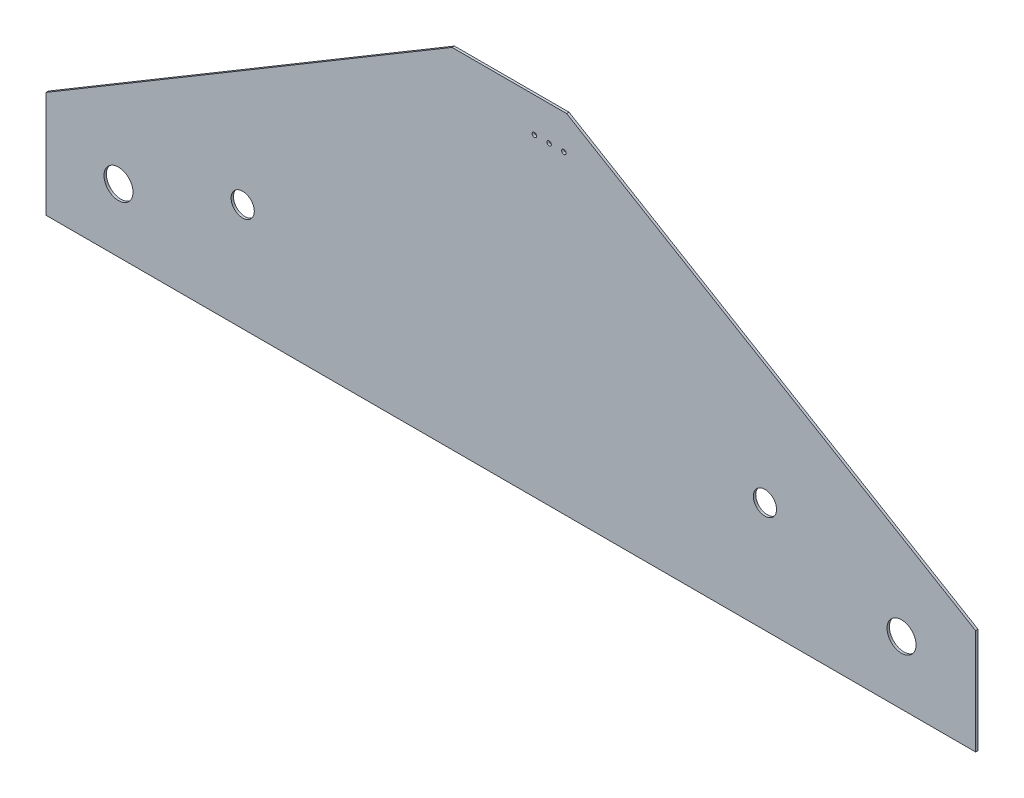
ISO-10303-21;
HEADER;
FILE_DESCRIPTION(('STEP AP214'),'2;1');
FILE_NAME('part.step','',(''),(''),'','','');
FILE_SCHEMA(('AUTOMOTIVE_DESIGN { 1 0 10303 214 1 1 1 1 }'));
ENDSEC;
DATA;
#1=APPLICATION_CONTEXT('core data for automotive mechanical design processes');
#2=APPLICATION_PROTOCOL_DEFINITION('international standard','automotive_design',2000,#1);
#3=PRODUCT_CONTEXT('',#1,'mechanical');
#4=PRODUCT('Part','Part','',(#3));
#5=PRODUCT_RELATED_PRODUCT_CATEGORY('part','',(#4));
#6=PRODUCT_DEFINITION_FORMATION('','',#4);
#7=PRODUCT_DEFINITION_CONTEXT('part definition',#1,'design');
#8=PRODUCT_DEFINITION('design','',#6,#7);
#9=PRODUCT_DEFINITION_SHAPE('','',#8);
#10=(LENGTH_UNIT() NAMED_UNIT(*) SI_UNIT(.MILLI.,.METRE.));
#11=(NAMED_UNIT(*) PLANE_ANGLE_UNIT() SI_UNIT($,.RADIAN.));
#12=(NAMED_UNIT(*) SI_UNIT($,.STERADIAN.) SOLID_ANGLE_UNIT());
#13=UNCERTAINTY_MEASURE_WITH_UNIT(LENGTH_MEASURE(1.E-05),#10,'distance_accuracy_value','');
#14=(GEOMETRIC_REPRESENTATION_CONTEXT(3) GLOBAL_UNCERTAINTY_ASSIGNED_CONTEXT((#13)) GLOBAL_UNIT_ASSIGNED_CONTEXT((#10,
#11,#12)) REPRESENTATION_CONTEXT('',''));
#15=CARTESIAN_POINT('',(0.,0.,0.));
#16=DIRECTION('',(0.,0.,1.));
#17=DIRECTION('',(1.,0.,0.));
#18=AXIS2_PLACEMENT_3D('',#15,#16,#17);
#19=CARTESIAN_POINT('',(0.5999988,0.5999988,0.41148));
#20=DIRECTION('',(0.,0.,1.));
#21=DIRECTION('',(1.,0.,0.));
#22=AXIS2_PLACEMENT_3D('',#19,#20,#21);
#23=PLANE('',#22);
#24=CARTESIAN_POINT('',(89.8809988,54.7019988,0.41148));
#25=DIRECTION('',(0.,0.,-1.));
#26=DIRECTION('',(-1.,0.,0.));
#27=AXIS2_PLACEMENT_3D('',#24,#25,#26);
#28=CIRCLE('',#27,0.381);
#29=CARTESIAN_POINT('',(89.4999988,54.7019988,0.41148));
#30=VERTEX_POINT('',#29);
#31=EDGE_CURVE('E115',#30,#30,#28,.T.);
#32=ORIENTED_EDGE('',*,*,#31,.T.);
#33=EDGE_LOOP('',(#32));
#34=FACE_BOUND('',#33,.T.);
#35=CARTESIAN_POINT('',(87.3409988,54.7019988,0.41148));
#36=DIRECTION('',(0.,0.,-1.));
#37=DIRECTION('',(-1.,0.,0.));
#38=AXIS2_PLACEMENT_3D('',#35,#36,#37);
#39=CIRCLE('',#38,0.381);
#40=CARTESIAN_POINT('',(86.9599988,54.7019988,0.41148));
#41=VERTEX_POINT('',#40);
#42=EDGE_CURVE('E118',#41,#41,#39,.T.);
#43=ORIENTED_EDGE('',*,*,#42,.T.);
#44=EDGE_LOOP('',(#43));
#45=FACE_BOUND('',#44,.T.);
#46=CARTESIAN_POINT('',(148.10000098,11.44999996,0.41148));
#47=DIRECTION('',(0.,0.,-1.));
#48=DIRECTION('',(-1.,0.,0.));
#49=AXIS2_PLACEMENT_3D('',#46,#47,#48);
#50=CIRCLE('',#49,2.50000008);
#51=CARTESIAN_POINT('',(145.6000009,11.44999996,0.41148));
#52=VERTEX_POINT('',#51);
#53=EDGE_CURVE('E121',#52,#52,#50,.T.);
#54=ORIENTED_EDGE('',*,*,#53,.T.);
#55=EDGE_LOOP('',(#54));
#56=FACE_BOUND('',#55,.T.);
#57=CARTESIAN_POINT('',(124.5519988,19.6499988,0.41148));
#58=DIRECTION('',(0.,0.,-1.));
#59=DIRECTION('',(-1.,0.,0.));
#60=AXIS2_PLACEMENT_3D('',#57,#58,#59);
#61=CIRCLE('',#60,1.99999854);
#62=CARTESIAN_POINT('',(122.55200026,19.6499988,0.41148));
#63=VERTEX_POINT('',#62);
#64=EDGE_CURVE('E124',#63,#63,#61,.T.);
#65=ORIENTED_EDGE('',*,*,#64,.T.);
#66=EDGE_LOOP('',(#65));
#67=FACE_BOUND('',#66,.T.);
#68=CARTESIAN_POINT('',(84.8009988,54.7019988,0.41148));
#69=DIRECTION('',(0.,0.,-1.));
#70=DIRECTION('',(-1.,0.,0.));
#71=AXIS2_PLACEMENT_3D('',#68,#69,#70);
#72=CIRCLE('',#71,0.381);
#73=CARTESIAN_POINT('',(84.4199988,54.7019988,0.41148));
#74=VERTEX_POINT('',#73);
#75=EDGE_CURVE('E127',#74,#74,#72,.T.);
#76=ORIENTED_EDGE('',*,*,#75,.T.);
#77=EDGE_LOOP('',(#76));
#78=FACE_BOUND('',#77,.T.);
#79=CARTESIAN_POINT('',(34.5089988,19.1419988,0.41148));
#80=DIRECTION('',(0.,0.,-1.));
#81=DIRECTION('',(-1.,0.,0.));
#82=AXIS2_PLACEMENT_3D('',#79,#80,#81);
#83=CIRCLE('',#82,1.99999854);
#84=CARTESIAN_POINT('',(32.50900026,19.1419988,0.41148));
#85=VERTEX_POINT('',#84);
#86=EDGE_CURVE('E129',#85,#85,#83,.T.);
#87=ORIENTED_EDGE('',*,*,#86,.T.);
#88=EDGE_LOOP('',(#87));
#89=FACE_BOUND('',#88,.T.);
#90=CARTESIAN_POINT('',(13.0999992,11.53999978,0.41148));
#91=DIRECTION('',(0.,0.,-1.));
#92=DIRECTION('',(-1.,0.,0.));
#93=AXIS2_PLACEMENT_3D('',#90,#91,#92);
#94=CIRCLE('',#93,2.50000008);
#95=CARTESIAN_POINT('',(10.59999912,11.53999978,0.41148));
#96=VERTEX_POINT('',#95);
#97=EDGE_CURVE('E20',#96,#96,#94,.T.);
#98=ORIENTED_EDGE('',*,*,#97,.T.);
#99=EDGE_LOOP('',(#98));
#100=FACE_BOUND('',#99,.T.);
#101=DIRECTION('',(-0.858999586489203,-0.511976279149121,0.));
#102=VECTOR('',#101,1.);
#103=CARTESIAN_POINT('',(0.60000134,18.94414296,0.41148));
#104=LINE('',#103,#102);
#105=CARTESIAN_POINT('',(0.600001340000001,18.94414296,0.41148));
#106=VERTEX_POINT('',#105);
#107=CARTESIAN_POINT('',(70.6098384599961,60.6710267400066,0.41148));
#108=VERTEX_POINT('',#107);
#109=EDGE_CURVE('E145',#106,#108,#104,.F.);
#110=ORIENTED_EDGE('',*,*,#109,.F.);
#111=DIRECTION('',(-1.38463805007299E-07,-0.99999999999999,0.));
#112=VECTOR('',#111,1.);
#113=CARTESIAN_POINT('',(0.5999988,0.5999988,0.41148));
#114=LINE('',#113,#112);
#115=CARTESIAN_POINT('',(0.599999435000001,0.5999988,0.41148));
#116=VERTEX_POINT('',#115);
#117=EDGE_CURVE('E85',#116,#106,#114,.F.);
#118=ORIENTED_EDGE('',*,*,#117,.F.);
#119=DIRECTION('',(1.,0.,0.));
#120=VECTOR('',#119,1.);
#121=CARTESIAN_POINT('',(160.8739988,0.5999988,0.41148));
#122=LINE('',#121,#120);
#123=CARTESIAN_POINT('',(160.8739988,0.599998799999999,0.41148));
#124=VERTEX_POINT('',#123);
#125=EDGE_CURVE('E81',#124,#116,#122,.F.);
#126=ORIENTED_EDGE('',*,*,#125,.F.);
#127=DIRECTION('',(-1.40170357279899E-07,0.99999999999999,0.));
#128=VECTOR('',#127,1.);
#129=CARTESIAN_POINT('',(160.87399626,18.72080584,0.41148));
#130=LINE('',#129,#128);
#131=CARTESIAN_POINT('',(160.873997529996,18.7208050844236,0.41148));
#132=VERTEX_POINT('',#131);
#133=EDGE_CURVE('E72',#132,#124,#130,.F.);
#134=ORIENTED_EDGE('',*,*,#133,.F.);
#135=DIRECTION('',(-0.85940677887988,0.511292468568929,0.));
#136=VECTOR('',#135,1.);
#137=CARTESIAN_POINT('',(90.36195034,60.67099626,0.41148));
#138=LINE('',#137,#136);
#139=CARTESIAN_POINT('',(90.36195034,60.67099626,0.41148));
#140=VERTEX_POINT('',#139);
#141=EDGE_CURVE('E67',#140,#132,#138,.F.);
#142=ORIENTED_EDGE('',*,*,#141,.F.);
#143=DIRECTION('',(-0.999999999998809,1.54312613175871E-06,0.));
#144=VECTOR('',#143,1.);
#145=CARTESIAN_POINT('',(70.60983846,60.67102674,0.41148));
#146=LINE('',#145,#144);
#147=EDGE_CURVE('E149',#108,#140,#146,.F.);
#148=ORIENTED_EDGE('',*,*,#147,.F.);
#149=EDGE_LOOP('',(#110,#118,#126,#134,#142,#148));
#150=FACE_BOUND('',#149,.T.);
#151=ADVANCED_FACE('F17',(#34,#45,#56,#67,#78,#89,#100,#150),#23,.T.);
#152=CARTESIAN_POINT('',(160.8739988,0.5999988,0.));
#153=DIRECTION('',(0.,-1.,0.));
#154=DIRECTION('',(0.,0.,-1.));
#155=AXIS2_PLACEMENT_3D('',#152,#153,#154);
#156=PLANE('',#155);
#157=DIRECTION('',(0.,0.,1.));
#158=VECTOR('',#157,1.);
#159=CARTESIAN_POINT('',(0.5999988,0.5999988,0.));
#160=LINE('',#159,#158);
#161=CARTESIAN_POINT('',(0.599999435000001,0.5999988,0.));
#162=VERTEX_POINT('',#161);
#163=EDGE_CURVE('E137',#162,#116,#160,.T.);
#164=ORIENTED_EDGE('',*,*,#163,.F.);
#165=DIRECTION('',(1.,0.,0.));
#166=VECTOR('',#165,1.);
#167=CARTESIAN_POINT('',(0.5999988,0.5999988,0.));
#168=LINE('',#167,#166);
#169=CARTESIAN_POINT('',(160.8739988,0.599998799999999,0.));
#170=VERTEX_POINT('',#169);
#171=EDGE_CURVE('E92',#162,#170,#168,.T.);
#172=ORIENTED_EDGE('',*,*,#171,.T.);
#173=DIRECTION('',(0.,0.,1.));
#174=VECTOR('',#173,1.);
#175=CARTESIAN_POINT('',(160.8739988,0.599998799999998,0.));
#176=LINE('',#175,#174);
#177=EDGE_CURVE('E77',#124,#170,#176,.F.);
#178=ORIENTED_EDGE('',*,*,#177,.F.);
#179=ORIENTED_EDGE('',*,*,#125,.T.);
#180=EDGE_LOOP('',(#164,#172,#178,#179));
#181=FACE_BOUND('',#180,.T.);
#182=ADVANCED_FACE('F91',(#181),#156,.T.);
#183=CARTESIAN_POINT('',(160.87399626,18.72080584,0.));
#184=DIRECTION('',(0.99999999999999,1.40170357279899E-07,0.));
#185=DIRECTION('',(-1.40170357279899E-07,0.99999999999999,0.));
#186=AXIS2_PLACEMENT_3D('',#183,#184,#185);
#187=PLANE('',#186);
#188=ORIENTED_EDGE('',*,*,#177,.T.);
#189=DIRECTION('',(0.,1.,0.));
#190=VECTOR('',#189,1.);
#191=CARTESIAN_POINT('',(160.8739988,0.5999988,0.));
#192=LINE('',#191,#190);
#193=CARTESIAN_POINT('',(160.873996894996,18.7208054622083,0.));
#194=VERTEX_POINT('',#193);
#195=EDGE_CURVE('E158',#170,#194,#192,.T.);
#196=ORIENTED_EDGE('',*,*,#195,.T.);
#197=DIRECTION('',(0.,0.,1.));
#198=VECTOR('',#197,1.);
#199=CARTESIAN_POINT('',(160.873996259983,18.7208058399719,0.));
#200=LINE('',#199,#198);
#201=EDGE_CURVE('E79',#132,#194,#200,.F.);
#202=ORIENTED_EDGE('',*,*,#201,.F.);
#203=ORIENTED_EDGE('',*,*,#133,.T.);
#204=EDGE_LOOP('',(#188,#196,#202,#203));
#205=FACE_BOUND('',#204,.T.);
#206=ADVANCED_FACE('F74',(#205),#187,.T.);
#207=CARTESIAN_POINT('',(90.36195034,60.67099626,0.));
#208=DIRECTION('',(0.511292468568929,0.85940677887988,0.));
#209=DIRECTION('',(-0.85940677887988,0.511292468568929,0.));
#210=AXIS2_PLACEMENT_3D('',#207,#208,#209);
#211=PLANE('',#210);
#212=ORIENTED_EDGE('',*,*,#201,.T.);
#213=DIRECTION('',(-0.859406778880083,0.511292468568587,0.));
#214=VECTOR('',#213,1.);
#215=CARTESIAN_POINT('',(160.87399626,18.72080584,0.));
#216=LINE('',#215,#214);
#217=CARTESIAN_POINT('',(90.36195034,60.67099626,0.));
#218=VERTEX_POINT('',#217);
#219=EDGE_CURVE('E153',#194,#218,#216,.T.);
#220=ORIENTED_EDGE('',*,*,#219,.T.);
#221=DIRECTION('',(0.,0.,1.));
#222=VECTOR('',#221,1.);
#223=CARTESIAN_POINT('',(90.36195034,60.67099626,0.));
#224=LINE('',#223,#222);
#225=EDGE_CURVE('E147',#140,#218,#224,.F.);
#226=ORIENTED_EDGE('',*,*,#225,.F.);
#227=ORIENTED_EDGE('',*,*,#141,.T.);
#228=EDGE_LOOP('',(#212,#220,#226,#227));
#229=FACE_BOUND('',#228,.T.);
#230=ADVANCED_FACE('F152',(#229),#211,.T.);
#231=CARTESIAN_POINT('',(70.60983846,60.67102674,0.));
#232=DIRECTION('',(1.54312613175871E-06,0.999999999998809,0.));
#233=DIRECTION('',(-0.999999999998809,1.54312613175871E-06,0.));
#234=AXIS2_PLACEMENT_3D('',#231,#232,#233);
#235=PLANE('',#234);
#236=ORIENTED_EDGE('',*,*,#225,.T.);
#237=DIRECTION('',(-0.99999999999881,1.54312613159079E-06,0.));
#238=VECTOR('',#237,1.);
#239=CARTESIAN_POINT('',(90.36195034,60.67099626,0.));
#240=LINE('',#239,#238);
#241=CARTESIAN_POINT('',(70.6098384599961,60.6710267400066,0.));
#242=VERTEX_POINT('',#241);
#243=EDGE_CURVE('E160',#218,#242,#240,.T.);
#244=ORIENTED_EDGE('',*,*,#243,.T.);
#245=DIRECTION('',(0.,0.,1.));
#246=VECTOR('',#245,1.);
#247=CARTESIAN_POINT('',(70.6098384599843,60.6710267400263,0.));
#248=LINE('',#247,#246);
#249=EDGE_CURVE('E143',#108,#242,#248,.F.);
#250=ORIENTED_EDGE('',*,*,#249,.F.);
#251=ORIENTED_EDGE('',*,*,#147,.T.);
#252=EDGE_LOOP('',(#236,#244,#250,#251));
#253=FACE_BOUND('',#252,.T.);
#254=ADVANCED_FACE('F173',(#253),#235,.T.);
#255=CARTESIAN_POINT('',(0.60000134,18.94414296,0.));
#256=DIRECTION('',(-0.511976279149121,0.858999586489203,0.));
#257=DIRECTION('',(-0.858999586489203,-0.511976279149121,0.));
#258=AXIS2_PLACEMENT_3D('',#255,#256,#257);
#259=PLANE('',#258);
#260=ORIENTED_EDGE('',*,*,#249,.T.);
#261=DIRECTION('',(-0.858999586489395,-0.511976279148799,0.));
#262=VECTOR('',#261,1.);
#263=CARTESIAN_POINT('',(70.60983846,60.67102674,0.));
#264=LINE('',#263,#262);
#265=CARTESIAN_POINT('',(0.60000134,18.94414296,0.));
#266=VERTEX_POINT('',#265);
#267=EDGE_CURVE('E164',#242,#266,#264,.T.);
#268=ORIENTED_EDGE('',*,*,#267,.T.);
#269=DIRECTION('',(0.,0.,1.));
#270=VECTOR('',#269,1.);
#271=CARTESIAN_POINT('',(0.60000134,18.94414296,0.));
#272=LINE('',#271,#270);
#273=EDGE_CURVE('E35',#106,#266,#272,.F.);
#274=ORIENTED_EDGE('',*,*,#273,.F.);
#275=ORIENTED_EDGE('',*,*,#109,.T.);
#276=EDGE_LOOP('',(#260,#268,#274,#275));
#277=FACE_BOUND('',#276,.T.);
#278=ADVANCED_FACE('F169',(#277),#259,.T.);
#279=CARTESIAN_POINT('',(0.5999988,0.5999988,0.));
#280=DIRECTION('',(-0.99999999999999,1.38463805007299E-07,0.));
#281=DIRECTION('',(-1.38463805007299E-07,-0.99999999999999,0.));
#282=AXIS2_PLACEMENT_3D('',#279,#280,#281);
#283=PLANE('',#282);
#284=ORIENTED_EDGE('',*,*,#273,.T.);
#285=DIRECTION('',(0.,1.,0.));
#286=VECTOR('',#285,1.);
#287=CARTESIAN_POINT('',(0.60000134,0.5999988,0.));
#288=LINE('',#287,#286);
#289=EDGE_CURVE('E114',#266,#162,#288,.F.);
#290=ORIENTED_EDGE('',*,*,#289,.T.);
#291=ORIENTED_EDGE('',*,*,#163,.T.);
#292=ORIENTED_EDGE('',*,*,#117,.T.);
#293=EDGE_LOOP('',(#284,#290,#291,#292));
#294=FACE_BOUND('',#293,.T.);
#295=ADVANCED_FACE('F167',(#294),#283,.T.);
#296=CARTESIAN_POINT('',(13.0999992,11.53999978,0.));
#297=DIRECTION('',(0.,0.,-1.));
#298=DIRECTION('',(-1.,0.,0.));
#299=AXIS2_PLACEMENT_3D('',#296,#297,#298);
#300=CYLINDRICAL_SURFACE('',#299,2.50000008);
#301=ORIENTED_EDGE('',*,*,#97,.F.);
#302=EDGE_LOOP('',(#301));
#303=FACE_BOUND('',#302,.T.);
#304=CARTESIAN_POINT('',(13.0999992,11.53999978,0.));
#305=DIRECTION('',(0.,0.,-1.));
#306=DIRECTION('',(-1.,0.,0.));
#307=AXIS2_PLACEMENT_3D('',#304,#305,#306);
#308=CIRCLE('',#307,2.50000008);
#309=CARTESIAN_POINT('',(10.59999912,11.53999978,0.));
#310=VERTEX_POINT('',#309);
#311=EDGE_CURVE('E111',#310,#310,#308,.T.);
#312=ORIENTED_EDGE('',*,*,#311,.T.);
#313=EDGE_LOOP('',(#312));
#314=FACE_BOUND('',#313,.T.);
#315=ADVANCED_FACE('F214',(#303,#314),#300,.F.);
#316=CARTESIAN_POINT('',(34.5089988,19.1419988,0.));
#317=DIRECTION('',(0.,0.,-1.));
#318=DIRECTION('',(-1.,0.,0.));
#319=AXIS2_PLACEMENT_3D('',#316,#317,#318);
#320=CYLINDRICAL_SURFACE('',#319,1.99999854);
#321=ORIENTED_EDGE('',*,*,#86,.F.);
#322=EDGE_LOOP('',(#321));
#323=FACE_BOUND('',#322,.T.);
#324=CARTESIAN_POINT('',(34.5089988,19.1419988,0.));
#325=DIRECTION('',(0.,0.,-1.));
#326=DIRECTION('',(-1.,0.,0.));
#327=AXIS2_PLACEMENT_3D('',#324,#325,#326);
#328=CIRCLE('',#327,1.99999854);
#329=CARTESIAN_POINT('',(32.50900026,19.1419988,0.));
#330=VERTEX_POINT('',#329);
#331=EDGE_CURVE('E108',#330,#330,#328,.T.);
#332=ORIENTED_EDGE('',*,*,#331,.T.);
#333=EDGE_LOOP('',(#332));
#334=FACE_BOUND('',#333,.T.);
#335=ADVANCED_FACE('F210',(#323,#334),#320,.F.);
#336=CARTESIAN_POINT('',(84.8009988,54.7019988,0.));
#337=DIRECTION('',(0.,0.,-1.));
#338=DIRECTION('',(-1.,0.,0.));
#339=AXIS2_PLACEMENT_3D('',#336,#337,#338);
#340=CYLINDRICAL_SURFACE('',#339,0.381);
#341=ORIENTED_EDGE('',*,*,#75,.F.);
#342=EDGE_LOOP('',(#341));
#343=FACE_BOUND('',#342,.T.);
#344=CARTESIAN_POINT('',(84.8009988,54.7019988,0.));
#345=DIRECTION('',(0.,0.,-1.));
#346=DIRECTION('',(-1.,0.,0.));
#347=AXIS2_PLACEMENT_3D('',#344,#345,#346);
#348=CIRCLE('',#347,0.381);
#349=CARTESIAN_POINT('',(84.4199988,54.7019988,0.));
#350=VERTEX_POINT('',#349);
#351=EDGE_CURVE('E105',#350,#350,#348,.T.);
#352=ORIENTED_EDGE('',*,*,#351,.T.);
#353=EDGE_LOOP('',(#352));
#354=FACE_BOUND('',#353,.T.);
#355=ADVANCED_FACE('F206',(#343,#354),#340,.F.);
#356=CARTESIAN_POINT('',(124.5519988,19.6499988,0.));
#357=DIRECTION('',(0.,0.,-1.));
#358=DIRECTION('',(-1.,0.,0.));
#359=AXIS2_PLACEMENT_3D('',#356,#357,#358);
#360=CYLINDRICAL_SURFACE('',#359,1.99999854);
#361=ORIENTED_EDGE('',*,*,#64,.F.);
#362=EDGE_LOOP('',(#361));
#363=FACE_BOUND('',#362,.T.);
#364=CARTESIAN_POINT('',(124.5519988,19.6499988,0.));
#365=DIRECTION('',(0.,0.,-1.));
#366=DIRECTION('',(-1.,0.,0.));
#367=AXIS2_PLACEMENT_3D('',#364,#365,#366);
#368=CIRCLE('',#367,1.99999854);
#369=CARTESIAN_POINT('',(122.55200026,19.6499988,0.));
#370=VERTEX_POINT('',#369);
#371=EDGE_CURVE('E102',#370,#370,#368,.T.);
#372=ORIENTED_EDGE('',*,*,#371,.T.);
#373=EDGE_LOOP('',(#372));
#374=FACE_BOUND('',#373,.T.);
#375=ADVANCED_FACE('F202',(#363,#374),#360,.F.);
#376=CARTESIAN_POINT('',(148.10000098,11.44999996,0.));
#377=DIRECTION('',(0.,0.,-1.));
#378=DIRECTION('',(-1.,0.,0.));
#379=AXIS2_PLACEMENT_3D('',#376,#377,#378);
#380=CYLINDRICAL_SURFACE('',#379,2.50000008);
#381=ORIENTED_EDGE('',*,*,#53,.F.);
#382=EDGE_LOOP('',(#381));
#383=FACE_BOUND('',#382,.T.);
#384=CARTESIAN_POINT('',(148.10000098,11.44999996,0.));
#385=DIRECTION('',(0.,0.,-1.));
#386=DIRECTION('',(-1.,0.,0.));
#387=AXIS2_PLACEMENT_3D('',#384,#385,#386);
#388=CIRCLE('',#387,2.50000008);
#389=CARTESIAN_POINT('',(145.6000009,11.44999996,0.));
#390=VERTEX_POINT('',#389);
#391=EDGE_CURVE('E99',#390,#390,#388,.T.);
#392=ORIENTED_EDGE('',*,*,#391,.T.);
#393=EDGE_LOOP('',(#392));
#394=FACE_BOUND('',#393,.T.);
#395=ADVANCED_FACE('F198',(#383,#394),#380,.F.);
#396=CARTESIAN_POINT('',(87.3409988,54.7019988,0.));
#397=DIRECTION('',(0.,0.,-1.));
#398=DIRECTION('',(-1.,0.,0.));
#399=AXIS2_PLACEMENT_3D('',#396,#397,#398);
#400=CYLINDRICAL_SURFACE('',#399,0.381);
#401=ORIENTED_EDGE('',*,*,#42,.F.);
#402=EDGE_LOOP('',(#401));
#403=FACE_BOUND('',#402,.T.);
#404=CARTESIAN_POINT('',(87.3409988,54.7019988,0.));
#405=DIRECTION('',(0.,0.,-1.));
#406=DIRECTION('',(-1.,0.,0.));
#407=AXIS2_PLACEMENT_3D('',#404,#405,#406);
#408=CIRCLE('',#407,0.381);
#409=CARTESIAN_POINT('',(86.9599988,54.7019988,0.));
#410=VERTEX_POINT('',#409);
#411=EDGE_CURVE('E26',#410,#410,#408,.T.);
#412=ORIENTED_EDGE('',*,*,#411,.T.);
#413=EDGE_LOOP('',(#412));
#414=FACE_BOUND('',#413,.T.);
#415=ADVANCED_FACE('F190',(#403,#414),#400,.F.);
#416=CARTESIAN_POINT('',(89.8809988,54.7019988,0.));
#417=DIRECTION('',(0.,0.,-1.));
#418=DIRECTION('',(-1.,0.,0.));
#419=AXIS2_PLACEMENT_3D('',#416,#417,#418);
#420=CYLINDRICAL_SURFACE('',#419,0.381);
#421=ORIENTED_EDGE('',*,*,#31,.F.);
#422=EDGE_LOOP('',(#421));
#423=FACE_BOUND('',#422,.T.);
#424=CARTESIAN_POINT('',(89.8809988,54.7019988,0.));
#425=DIRECTION('',(0.,0.,-1.));
#426=DIRECTION('',(-1.,0.,0.));
#427=AXIS2_PLACEMENT_3D('',#424,#425,#426);
#428=CIRCLE('',#427,0.381);
#429=CARTESIAN_POINT('',(89.4999988,54.7019988,0.));
#430=VERTEX_POINT('',#429);
#431=EDGE_CURVE('E11',#430,#430,#428,.T.);
#432=ORIENTED_EDGE('',*,*,#431,.T.);
#433=EDGE_LOOP('',(#432));
#434=FACE_BOUND('',#433,.T.);
#435=ADVANCED_FACE('F184',(#423,#434),#420,.F.);
#436=CARTESIAN_POINT('',(0.5999988,0.5999988,0.));
#437=DIRECTION('',(0.,0.,1.));
#438=DIRECTION('',(1.,0.,0.));
#439=AXIS2_PLACEMENT_3D('',#436,#437,#438);
#440=PLANE('',#439);
#441=ORIENTED_EDGE('',*,*,#431,.F.);
#442=EDGE_LOOP('',(#441));
#443=FACE_BOUND('',#442,.T.);
#444=ORIENTED_EDGE('',*,*,#411,.F.);
#445=EDGE_LOOP('',(#444));
#446=FACE_BOUND('',#445,.T.);
#447=ORIENTED_EDGE('',*,*,#391,.F.);
#448=EDGE_LOOP('',(#447));
#449=FACE_BOUND('',#448,.T.);
#450=ORIENTED_EDGE('',*,*,#371,.F.);
#451=EDGE_LOOP('',(#450));
#452=FACE_BOUND('',#451,.T.);
#453=ORIENTED_EDGE('',*,*,#351,.F.);
#454=EDGE_LOOP('',(#453));
#455=FACE_BOUND('',#454,.T.);
#456=ORIENTED_EDGE('',*,*,#331,.F.);
#457=EDGE_LOOP('',(#456));
#458=FACE_BOUND('',#457,.T.);
#459=ORIENTED_EDGE('',*,*,#311,.F.);
#460=EDGE_LOOP('',(#459));
#461=FACE_BOUND('',#460,.T.);
#462=ORIENTED_EDGE('',*,*,#267,.F.);
#463=ORIENTED_EDGE('',*,*,#243,.F.);
#464=ORIENTED_EDGE('',*,*,#219,.F.);
#465=ORIENTED_EDGE('',*,*,#195,.F.);
#466=ORIENTED_EDGE('',*,*,#171,.F.);
#467=ORIENTED_EDGE('',*,*,#289,.F.);
#468=EDGE_LOOP('',(#462,#463,#464,#465,#466,#467));
#469=FACE_BOUND('',#468,.T.);
#470=ADVANCED_FACE('F157',(#443,#446,#449,#452,#455,#458,#461,#469),#440,.F.);
#471=CLOSED_SHELL('',(#151,#182,#206,#230,#254,#278,#295,#315,#335,#355,#375,#395,#415,#435,#470));
#472=MANIFOLD_SOLID_BREP('B1',#471);
#473=ADVANCED_BREP_SHAPE_REPRESENTATION('',(#18,#472),#14);
#474=SHAPE_DEFINITION_REPRESENTATION(#9,#473);
ENDSEC;
END-ISO-10303-21;
